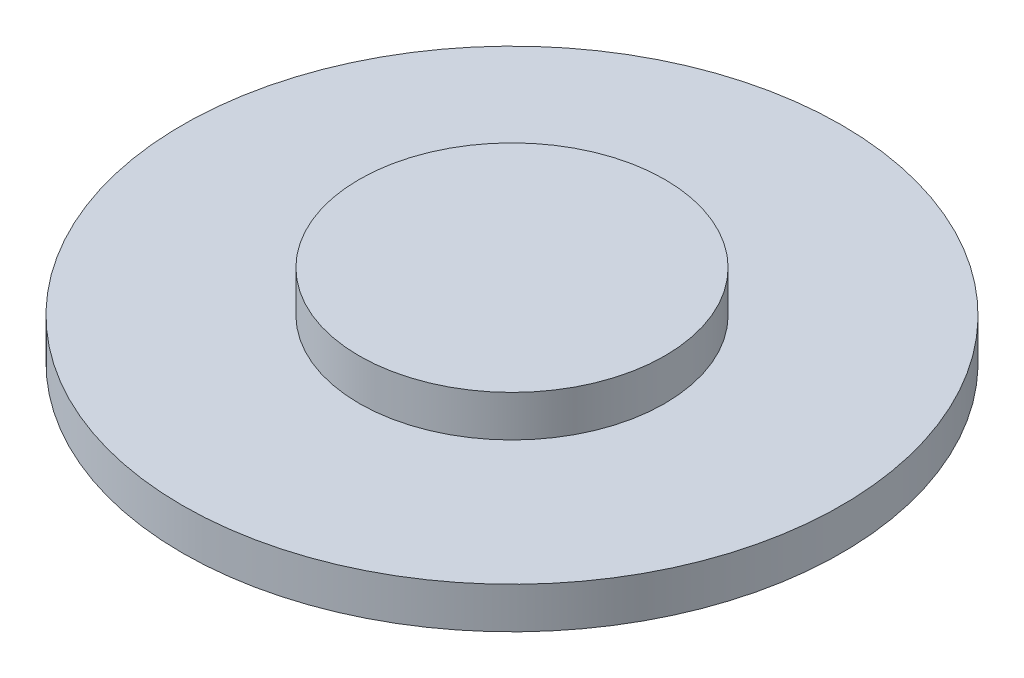
ISO-10303-21;
HEADER;
FILE_DESCRIPTION(('STEP AP214'),'2;1');
FILE_NAME('part.step','',(''),(''),'','','');
FILE_SCHEMA(('AUTOMOTIVE_DESIGN { 1 0 10303 214 1 1 1 1 }'));
ENDSEC;
DATA;
#1=APPLICATION_CONTEXT('core data for automotive mechanical design processes');
#2=APPLICATION_PROTOCOL_DEFINITION('international standard','automotive_design',2000,#1);
#3=PRODUCT_CONTEXT('',#1,'mechanical');
#4=PRODUCT('Part','Part','',(#3));
#5=PRODUCT_RELATED_PRODUCT_CATEGORY('part','',(#4));
#6=PRODUCT_DEFINITION_FORMATION('','',#4);
#7=PRODUCT_DEFINITION_CONTEXT('part definition',#1,'design');
#8=PRODUCT_DEFINITION('design','',#6,#7);
#9=PRODUCT_DEFINITION_SHAPE('','',#8);
#10=(LENGTH_UNIT() NAMED_UNIT(*) SI_UNIT(.MILLI.,.METRE.));
#11=(NAMED_UNIT(*) PLANE_ANGLE_UNIT() SI_UNIT($,.RADIAN.));
#12=(NAMED_UNIT(*) SI_UNIT($,.STERADIAN.) SOLID_ANGLE_UNIT());
#13=UNCERTAINTY_MEASURE_WITH_UNIT(LENGTH_MEASURE(1.E-05),#10,'distance_accuracy_value','');
#14=(GEOMETRIC_REPRESENTATION_CONTEXT(3) GLOBAL_UNCERTAINTY_ASSIGNED_CONTEXT((#13)) GLOBAL_UNIT_ASSIGNED_CONTEXT((#10,
#11,#12)) REPRESENTATION_CONTEXT('',''));
#15=CARTESIAN_POINT('',(0.,0.,0.));
#16=DIRECTION('',(0.,0.,1.));
#17=DIRECTION('',(1.,0.,0.));
#18=AXIS2_PLACEMENT_3D('',#15,#16,#17);
#19=CARTESIAN_POINT('',(0.,0.,0.));
#20=DIRECTION('',(0.,-1.,0.));
#21=DIRECTION('',(0.,0.,-1.));
#22=AXIS2_PLACEMENT_3D('',#19,#20,#21);
#23=PLANE('',#22);
#24=CARTESIAN_POINT('',(0.,0.,0.));
#25=DIRECTION('',(0.,-1.,0.));
#26=DIRECTION('',(0.,0.,-1.));
#27=AXIS2_PLACEMENT_3D('',#24,#25,#26);
#28=CIRCLE('',#27,40.);
#29=CARTESIAN_POINT('',(0.,0.,-40.));
#30=VERTEX_POINT('',#29);
#31=EDGE_CURVE('E9',#30,#30,#28,.F.);
#32=ORIENTED_EDGE('',*,*,#31,.T.);
#33=EDGE_LOOP('',(#32));
#34=FACE_BOUND('',#33,.T.);
#35=CARTESIAN_POINT('',(0.,0.,0.));
#36=DIRECTION('',(0.,-1.,0.));
#37=DIRECTION('',(1.,0.,0.));
#38=AXIS2_PLACEMENT_3D('',#35,#36,#37);
#39=CIRCLE('',#38,18.55);
#40=CARTESIAN_POINT('',(18.55,0.,0.));
#41=VERTEX_POINT('',#40);
#42=EDGE_CURVE('E20',#41,#41,#39,.T.);
#43=ORIENTED_EDGE('',*,*,#42,.T.);
#44=EDGE_LOOP('',(#43));
#45=FACE_BOUND('',#44,.T.);
#46=ADVANCED_FACE('F14',(#34,#45),#23,.F.);
#47=CARTESIAN_POINT('',(0.,-7.,0.));
#48=DIRECTION('',(0.,1.,0.));
#49=DIRECTION('',(0.,0.,1.));
#50=AXIS2_PLACEMENT_3D('',#47,#48,#49);
#51=CYLINDRICAL_SURFACE('',#50,40.);
#52=CARTESIAN_POINT('',(0.,-5.,0.));
#53=DIRECTION('',(0.,1.,0.));
#54=DIRECTION('',(0.,0.,-1.));
#55=AXIS2_PLACEMENT_3D('',#52,#53,#54);
#56=CIRCLE('',#55,40.);
#57=CARTESIAN_POINT('',(0.,-5.,-40.));
#58=VERTEX_POINT('',#57);
#59=EDGE_CURVE('E30',#58,#58,#56,.T.);
#60=ORIENTED_EDGE('',*,*,#59,.T.);
#61=EDGE_LOOP('',(#60));
#62=FACE_BOUND('',#61,.T.);
#63=ORIENTED_EDGE('',*,*,#31,.F.);
#64=EDGE_LOOP('',(#63));
#65=FACE_BOUND('',#64,.T.);
#66=ADVANCED_FACE('F35',(#62,#65),#51,.T.);
#67=CARTESIAN_POINT('',(0.,0.,0.));
#68=DIRECTION('',(0.,1.,0.));
#69=DIRECTION('',(0.,0.,1.));
#70=AXIS2_PLACEMENT_3D('',#67,#68,#69);
#71=CYLINDRICAL_SURFACE('',#70,18.55);
#72=ORIENTED_EDGE('',*,*,#42,.F.);
#73=EDGE_LOOP('',(#72));
#74=FACE_BOUND('',#73,.T.);
#75=CARTESIAN_POINT('',(0.,5.,0.));
#76=DIRECTION('',(0.,-1.,0.));
#77=DIRECTION('',(1.,0.,0.));
#78=AXIS2_PLACEMENT_3D('',#75,#76,#77);
#79=CIRCLE('',#78,18.55);
#80=CARTESIAN_POINT('',(18.55,5.,0.));
#81=VERTEX_POINT('',#80);
#82=EDGE_CURVE('E24',#81,#81,#79,.T.);
#83=ORIENTED_EDGE('',*,*,#82,.T.);
#84=EDGE_LOOP('',(#83));
#85=FACE_BOUND('',#84,.T.);
#86=ADVANCED_FACE('F46',(#74,#85),#71,.T.);
#87=CARTESIAN_POINT('',(0.,5.,0.));
#88=DIRECTION('',(0.,1.,0.));
#89=DIRECTION('',(0.,0.,1.));
#90=AXIS2_PLACEMENT_3D('',#87,#88,#89);
#91=PLANE('',#90);
#92=ORIENTED_EDGE('',*,*,#82,.F.);
#93=EDGE_LOOP('',(#92));
#94=FACE_BOUND('',#93,.T.);
#95=ADVANCED_FACE('F40',(#94),#91,.T.);
#96=CARTESIAN_POINT('',(0.,-5.,0.));
#97=DIRECTION('',(0.,1.,0.));
#98=DIRECTION('',(0.,0.,1.));
#99=AXIS2_PLACEMENT_3D('',#96,#97,#98);
#100=PLANE('',#99);
#101=ORIENTED_EDGE('',*,*,#59,.F.);
#102=EDGE_LOOP('',(#101));
#103=FACE_BOUND('',#102,.T.);
#104=ADVANCED_FACE('F38',(#103),#100,.F.);
#105=CLOSED_SHELL('',(#46,#66,#86,#95,#104));
#106=MANIFOLD_SOLID_BREP('B1',#105);
#107=ADVANCED_BREP_SHAPE_REPRESENTATION('',(#18,#106),#14);
#108=SHAPE_DEFINITION_REPRESENTATION(#9,#107);
ENDSEC;
END-ISO-10303-21;
